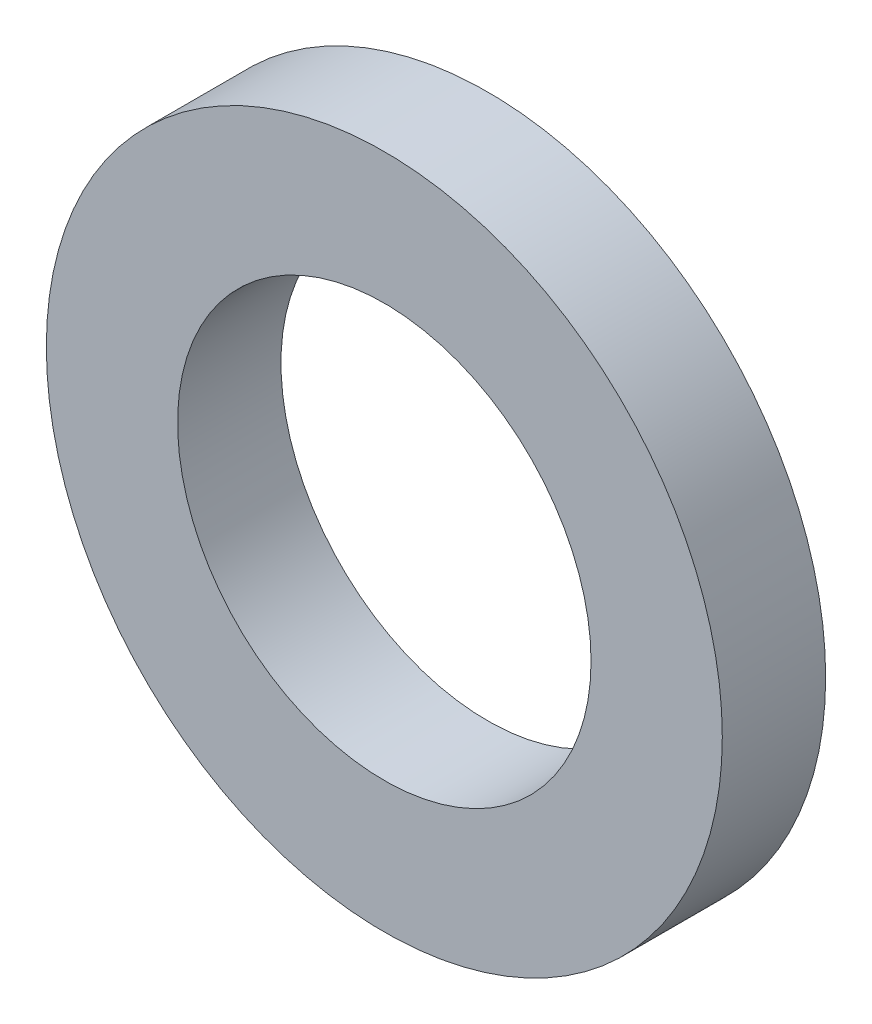
ISO-10303-21;
HEADER;
FILE_DESCRIPTION(('STEP AP214'),'2;1');
FILE_NAME('part.step','',(''),(''),'','','');
FILE_SCHEMA(('AUTOMOTIVE_DESIGN { 1 0 10303 214 1 1 1 1 }'));
ENDSEC;
DATA;
#1=APPLICATION_CONTEXT('core data for automotive mechanical design processes');
#2=APPLICATION_PROTOCOL_DEFINITION('international standard','automotive_design',2000,#1);
#3=PRODUCT_CONTEXT('',#1,'mechanical');
#4=PRODUCT('Part','Part','',(#3));
#5=PRODUCT_RELATED_PRODUCT_CATEGORY('part','',(#4));
#6=PRODUCT_DEFINITION_FORMATION('','',#4);
#7=PRODUCT_DEFINITION_CONTEXT('part definition',#1,'design');
#8=PRODUCT_DEFINITION('design','',#6,#7);
#9=PRODUCT_DEFINITION_SHAPE('','',#8);
#10=(LENGTH_UNIT() NAMED_UNIT(*) SI_UNIT(.MILLI.,.METRE.));
#11=(NAMED_UNIT(*) PLANE_ANGLE_UNIT() SI_UNIT($,.RADIAN.));
#12=(NAMED_UNIT(*) SI_UNIT($,.STERADIAN.) SOLID_ANGLE_UNIT());
#13=UNCERTAINTY_MEASURE_WITH_UNIT(LENGTH_MEASURE(1.E-05),#10,'distance_accuracy_value','');
#14=(GEOMETRIC_REPRESENTATION_CONTEXT(3) GLOBAL_UNCERTAINTY_ASSIGNED_CONTEXT((#13)) GLOBAL_UNIT_ASSIGNED_CONTEXT((#10,
#11,#12)) REPRESENTATION_CONTEXT('',''));
#15=CARTESIAN_POINT('',(0.,0.,0.));
#16=DIRECTION('',(0.,0.,1.));
#17=DIRECTION('',(1.,0.,0.));
#18=AXIS2_PLACEMENT_3D('',#15,#16,#17);
#19=CARTESIAN_POINT('',(0.,0.,0.));
#20=DIRECTION('',(0.,0.,-1.));
#21=DIRECTION('',(1.,0.,0.));
#22=AXIS2_PLACEMENT_3D('',#19,#20,#21);
#23=CYLINDRICAL_SURFACE('',#22,0.6539992);
#24=CARTESIAN_POINT('',(0.,0.,0.1999996));
#25=DIRECTION('',(0.,0.,1.));
#26=DIRECTION('',(1.,0.,0.));
#27=AXIS2_PLACEMENT_3D('',#24,#25,#26);
#28=CIRCLE('',#27,0.6539992);
#29=CARTESIAN_POINT('',(0.6539992,0.,0.1999996));
#30=VERTEX_POINT('',#29);
#31=EDGE_CURVE('E11',#30,#30,#28,.T.);
#32=ORIENTED_EDGE('',*,*,#31,.F.);
#33=DIRECTION('',(0.,0.,1.));
#34=VECTOR('',#33,1.);
#35=CARTESIAN_POINT('',(0.6539992,0.,0.));
#36=LINE('',#35,#34);
#37=CARTESIAN_POINT('',(0.6539992,0.,0.));
#38=VERTEX_POINT('',#37);
#39=EDGE_CURVE('E24',#38,#30,#36,.T.);
#40=ORIENTED_EDGE('',*,*,#39,.F.);
#41=CARTESIAN_POINT('',(0.,0.,0.));
#42=DIRECTION('',(0.,0.,1.));
#43=DIRECTION('',(1.,0.,0.));
#44=AXIS2_PLACEMENT_3D('',#41,#42,#43);
#45=CIRCLE('',#44,0.6539992);
#46=EDGE_CURVE('E46',#38,#38,#45,.T.);
#47=ORIENTED_EDGE('',*,*,#46,.T.);
#48=ORIENTED_EDGE('',*,*,#39,.T.);
#49=EDGE_LOOP('',(#32,#40,#47,#48));
#50=FACE_BOUND('',#49,.T.);
#51=ADVANCED_FACE('F17',(#50),#23,.T.);
#52=CARTESIAN_POINT('',(0.,0.,0.));
#53=DIRECTION('',(0.,0.,-1.));
#54=DIRECTION('',(1.,0.,0.));
#55=AXIS2_PLACEMENT_3D('',#52,#53,#54);
#56=CYLINDRICAL_SURFACE('',#55,0.3999992);
#57=DIRECTION('',(0.,0.,1.));
#58=VECTOR('',#57,1.);
#59=CARTESIAN_POINT('',(0.3999992,0.,0.));
#60=LINE('',#59,#58);
#61=CARTESIAN_POINT('',(0.3999992,0.,0.));
#62=VERTEX_POINT('',#61);
#63=CARTESIAN_POINT('',(0.3999992,0.,0.1999996));
#64=VERTEX_POINT('',#63);
#65=EDGE_CURVE('E40',#62,#64,#60,.T.);
#66=ORIENTED_EDGE('',*,*,#65,.T.);
#67=CARTESIAN_POINT('',(0.,0.,0.1999996));
#68=DIRECTION('',(0.,0.,1.));
#69=DIRECTION('',(1.,0.,0.));
#70=AXIS2_PLACEMENT_3D('',#67,#68,#69);
#71=CIRCLE('',#70,0.3999992);
#72=EDGE_CURVE('E45',#64,#64,#71,.T.);
#73=ORIENTED_EDGE('',*,*,#72,.T.);
#74=ORIENTED_EDGE('',*,*,#65,.F.);
#75=CARTESIAN_POINT('',(0.,0.,0.));
#76=DIRECTION('',(0.,0.,1.));
#77=DIRECTION('',(1.,0.,0.));
#78=AXIS2_PLACEMENT_3D('',#75,#76,#77);
#79=CIRCLE('',#78,0.3999992);
#80=EDGE_CURVE('E43',#62,#62,#79,.T.);
#81=ORIENTED_EDGE('',*,*,#80,.F.);
#82=EDGE_LOOP('',(#66,#73,#74,#81));
#83=FACE_BOUND('',#82,.T.);
#84=ADVANCED_FACE('F42',(#83),#56,.F.);
#85=CARTESIAN_POINT('',(0.6539992,0.,0.));
#86=DIRECTION('',(0.,0.,-1.));
#87=DIRECTION('',(-1.,0.,0.));
#88=AXIS2_PLACEMENT_3D('',#85,#86,#87);
#89=PLANE('',#88);
#90=ORIENTED_EDGE('',*,*,#46,.F.);
#91=EDGE_LOOP('',(#90));
#92=FACE_BOUND('',#91,.T.);
#93=ORIENTED_EDGE('',*,*,#80,.T.);
#94=EDGE_LOOP('',(#93));
#95=FACE_BOUND('',#94,.T.);
#96=ADVANCED_FACE('F49',(#92,#95),#89,.T.);
#97=CARTESIAN_POINT('',(0.6539992,0.,0.1999996));
#98=DIRECTION('',(0.,0.,-1.));
#99=DIRECTION('',(-1.,0.,0.));
#100=AXIS2_PLACEMENT_3D('',#97,#98,#99);
#101=PLANE('',#100);
#102=ORIENTED_EDGE('',*,*,#31,.T.);
#103=EDGE_LOOP('',(#102));
#104=FACE_BOUND('',#103,.T.);
#105=ORIENTED_EDGE('',*,*,#72,.F.);
#106=EDGE_LOOP('',(#105));
#107=FACE_BOUND('',#106,.T.);
#108=ADVANCED_FACE('F56',(#104,#107),#101,.F.);
#109=CLOSED_SHELL('',(#51,#84,#96,#108));
#110=MANIFOLD_SOLID_BREP('B1',#109);
#111=ADVANCED_BREP_SHAPE_REPRESENTATION('',(#18,#110),#14);
#112=SHAPE_DEFINITION_REPRESENTATION(#9,#111);
ENDSEC;
END-ISO-10303-21;
